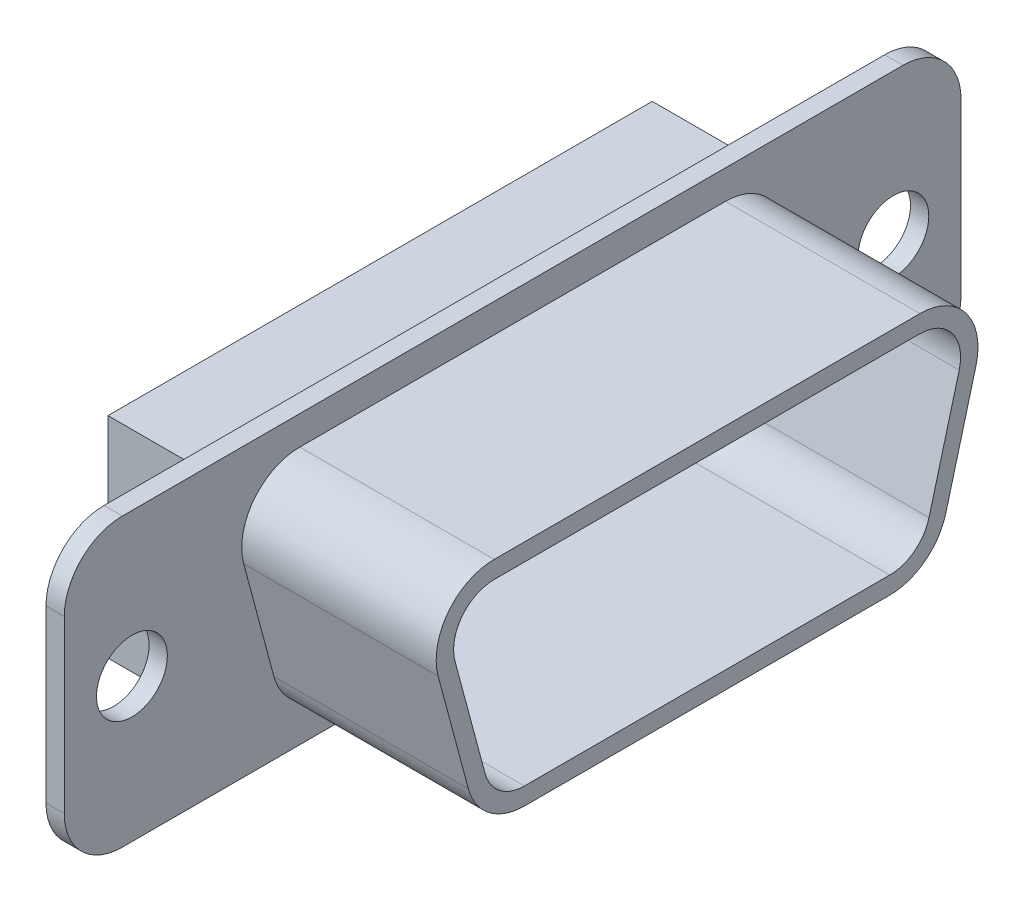
ISO-10303-21;
HEADER;
FILE_DESCRIPTION(('STEP AP214'),'2;1');
FILE_NAME('part.step','',(''),(''),'','','');
FILE_SCHEMA(('AUTOMOTIVE_DESIGN { 1 0 10303 214 1 1 1 1 }'));
ENDSEC;
DATA;
#1=APPLICATION_CONTEXT('core data for automotive mechanical design processes');
#2=APPLICATION_PROTOCOL_DEFINITION('international standard','automotive_design',2000,#1);
#3=PRODUCT_CONTEXT('',#1,'mechanical');
#4=PRODUCT('Part','Part','',(#3));
#5=PRODUCT_RELATED_PRODUCT_CATEGORY('part','',(#4));
#6=PRODUCT_DEFINITION_FORMATION('','',#4);
#7=PRODUCT_DEFINITION_CONTEXT('part definition',#1,'design');
#8=PRODUCT_DEFINITION('design','',#6,#7);
#9=PRODUCT_DEFINITION_SHAPE('','',#8);
#10=(LENGTH_UNIT() NAMED_UNIT(*) SI_UNIT(.MILLI.,.METRE.));
#11=(NAMED_UNIT(*) PLANE_ANGLE_UNIT() SI_UNIT($,.RADIAN.));
#12=(NAMED_UNIT(*) SI_UNIT($,.STERADIAN.) SOLID_ANGLE_UNIT());
#13=UNCERTAINTY_MEASURE_WITH_UNIT(LENGTH_MEASURE(1.E-05),#10,'distance_accuracy_value','');
#14=(GEOMETRIC_REPRESENTATION_CONTEXT(3) GLOBAL_UNCERTAINTY_ASSIGNED_CONTEXT((#13)) GLOBAL_UNIT_ASSIGNED_CONTEXT((#10,
#11,#12)) REPRESENTATION_CONTEXT('',''));
#15=CARTESIAN_POINT('',(0.,0.,0.));
#16=DIRECTION('',(0.,0.,1.));
#17=DIRECTION('',(1.,0.,0.));
#18=AXIS2_PLACEMENT_3D('',#15,#16,#17);
#19=CARTESIAN_POINT('',(0.,3.735,-17.08));
#20=DIRECTION('',(1.,0.,0.));
#21=DIRECTION('',(0.,0.,-1.));
#22=AXIS2_PLACEMENT_3D('',#19,#20,#21);
#23=PLANE('',#22);
#24=CARTESIAN_POINT('',(0.,3.735,-17.08));
#25=DIRECTION('',(1.,0.,0.));
#26=DIRECTION('',(0.,0.,-1.));
#27=AXIS2_PLACEMENT_3D('',#24,#25,#26);
#28=CIRCLE('',#27,2.54);
#29=CARTESIAN_POINT('',(0.,3.73499999999998,-19.62));
#30=VERTEX_POINT('',#29);
#31=CARTESIAN_POINT('',(0.,6.275,-17.08));
#32=VERTEX_POINT('',#31);
#33=EDGE_CURVE('E379',#30,#32,#28,.T.);
#34=ORIENTED_EDGE('',*,*,#33,.F.);
#35=DIRECTION('',(0.,1.,0.));
#36=VECTOR('',#35,1.);
#37=CARTESIAN_POINT('',(0.,-3.73499999999998,-19.62));
#38=LINE('',#37,#36);
#39=CARTESIAN_POINT('',(0.,-3.73499999999998,-19.62));
#40=VERTEX_POINT('',#39);
#41=EDGE_CURVE('E384',#40,#30,#38,.T.);
#42=ORIENTED_EDGE('',*,*,#41,.F.);
#43=CARTESIAN_POINT('',(0.,-3.735,-17.08));
#44=DIRECTION('',(1.,0.,0.));
#45=DIRECTION('',(0.,0.,-1.));
#46=AXIS2_PLACEMENT_3D('',#43,#44,#45);
#47=CIRCLE('',#46,2.54);
#48=CARTESIAN_POINT('',(0.,-6.275,-17.08));
#49=VERTEX_POINT('',#48);
#50=EDGE_CURVE('E411',#49,#40,#47,.T.);
#51=ORIENTED_EDGE('',*,*,#50,.F.);
#52=DIRECTION('',(0.,0.,-1.));
#53=VECTOR('',#52,1.);
#54=CARTESIAN_POINT('',(0.,-6.275,17.08));
#55=LINE('',#54,#53);
#56=CARTESIAN_POINT('',(0.,-6.275,17.08));
#57=VERTEX_POINT('',#56);
#58=EDGE_CURVE('E409',#57,#49,#55,.T.);
#59=ORIENTED_EDGE('',*,*,#58,.F.);
#60=CARTESIAN_POINT('',(0.,-3.735,17.08));
#61=DIRECTION('',(1.,0.,0.));
#62=DIRECTION('',(0.,0.,1.));
#63=AXIS2_PLACEMENT_3D('',#60,#61,#62);
#64=CIRCLE('',#63,2.54);
#65=CARTESIAN_POINT('',(0.,-3.73499999999998,19.62));
#66=VERTEX_POINT('',#65);
#67=EDGE_CURVE('E407',#66,#57,#64,.T.);
#68=ORIENTED_EDGE('',*,*,#67,.F.);
#69=DIRECTION('',(0.,-1.,0.));
#70=VECTOR('',#69,1.);
#71=CARTESIAN_POINT('',(0.,-3.73499999999998,19.62));
#72=LINE('',#71,#70);
#73=CARTESIAN_POINT('',(0.,3.73499999999998,19.62));
#74=VERTEX_POINT('',#73);
#75=EDGE_CURVE('E405',#74,#66,#72,.T.);
#76=ORIENTED_EDGE('',*,*,#75,.F.);
#77=CARTESIAN_POINT('',(0.,3.735,17.08));
#78=DIRECTION('',(1.,0.,0.));
#79=DIRECTION('',(0.,0.,-1.));
#80=AXIS2_PLACEMENT_3D('',#77,#78,#79);
#81=CIRCLE('',#80,2.54);
#82=CARTESIAN_POINT('',(0.,6.275,17.08));
#83=VERTEX_POINT('',#82);
#84=EDGE_CURVE('E403',#83,#74,#81,.T.);
#85=ORIENTED_EDGE('',*,*,#84,.F.);
#86=DIRECTION('',(0.,0.,1.));
#87=VECTOR('',#86,1.);
#88=CARTESIAN_POINT('',(0.,6.275,17.08));
#89=LINE('',#88,#87);
#90=EDGE_CURVE('E401',#32,#83,#89,.T.);
#91=ORIENTED_EDGE('',*,*,#90,.F.);
#92=EDGE_LOOP('',(#34,#42,#51,#59,#68,#76,#85,#91));
#93=FACE_BOUND('',#92,.T.);
#94=CARTESIAN_POINT('',(0.,0.,-16.66));
#95=DIRECTION('',(1.,0.,0.));
#96=DIRECTION('',(0.,0.,-1.));
#97=AXIS2_PLACEMENT_3D('',#94,#95,#96);
#98=CIRCLE('',#97,1.549999948);
#99=CARTESIAN_POINT('',(0.,0.,-18.209999948));
#100=VERTEX_POINT('',#99);
#101=EDGE_CURVE('E255',#100,#100,#98,.T.);
#102=ORIENTED_EDGE('',*,*,#101,.T.);
#103=EDGE_LOOP('',(#102));
#104=FACE_BOUND('',#103,.T.);
#105=CARTESIAN_POINT('',(0.,0.,16.66));
#106=DIRECTION('',(1.,0.,0.));
#107=DIRECTION('',(0.,0.,-1.));
#108=AXIS2_PLACEMENT_3D('',#105,#106,#107);
#109=CIRCLE('',#108,1.549999948);
#110=CARTESIAN_POINT('',(0.,0.,15.110000052));
#111=VERTEX_POINT('',#110);
#112=EDGE_CURVE('E244',#111,#111,#109,.T.);
#113=ORIENTED_EDGE('',*,*,#112,.T.);
#114=EDGE_LOOP('',(#113));
#115=FACE_BOUND('',#114,.T.);
#116=DIRECTION('',(0.,1.,0.));
#117=VECTOR('',#116,1.);
#118=CARTESIAN_POINT('',(0.,-4.5957741823946,11.9090496204659));
#119=LINE('',#118,#117);
#120=CARTESIAN_POINT('',(0.,-4.5957741823946,11.9090496204659));
#121=VERTEX_POINT('',#120);
#122=CARTESIAN_POINT('',(0.,4.5957741823946,11.9090496204659));
#123=VERTEX_POINT('',#122);
#124=EDGE_CURVE('E240',#121,#123,#119,.T.);
#125=ORIENTED_EDGE('',*,*,#124,.F.);
#126=DIRECTION('',(0.,0.,1.));
#127=VECTOR('',#126,1.);
#128=CARTESIAN_POINT('',(0.,-4.5957741823946,-11.9090496204659));
#129=LINE('',#128,#127);
#130=CARTESIAN_POINT('',(0.,-4.5957741823946,-11.9090496204659));
#131=VERTEX_POINT('',#130);
#132=EDGE_CURVE('E237',#131,#121,#129,.T.);
#133=ORIENTED_EDGE('',*,*,#132,.F.);
#134=DIRECTION('',(0.,-1.,0.));
#135=VECTOR('',#134,1.);
#136=CARTESIAN_POINT('',(0.,-4.5957741823946,-11.9090496204659));
#137=LINE('',#136,#135);
#138=CARTESIAN_POINT('',(0.,4.5957741823946,-11.9090496204659));
#139=VERTEX_POINT('',#138);
#140=EDGE_CURVE('E55',#139,#131,#137,.T.);
#141=ORIENTED_EDGE('',*,*,#140,.F.);
#142=DIRECTION('',(0.,0.,-1.));
#143=VECTOR('',#142,1.);
#144=CARTESIAN_POINT('',(0.,4.5957741823946,-11.9090496204659));
#145=LINE('',#144,#143);
#146=EDGE_CURVE('E50',#123,#139,#145,.T.);
#147=ORIENTED_EDGE('',*,*,#146,.F.);
#148=EDGE_LOOP('',(#125,#133,#141,#147));
#149=FACE_BOUND('',#148,.T.);
#150=ADVANCED_FACE('F35',(#93,#104,#115,#149),#23,.F.);
#151=CARTESIAN_POINT('',(0.8,3.735,-17.08));
#152=DIRECTION('',(1.,0.,0.));
#153=DIRECTION('',(0.,0.,-1.));
#154=AXIS2_PLACEMENT_3D('',#151,#152,#153);
#155=PLANE('',#154);
#156=CARTESIAN_POINT('',(0.8,0.,16.66));
#157=DIRECTION('',(1.,0.,0.));
#158=DIRECTION('',(0.,0.,-1.));
#159=AXIS2_PLACEMENT_3D('',#156,#157,#158);
#160=CIRCLE('',#159,1.549999948);
#161=CARTESIAN_POINT('',(0.8,0.,15.110000052));
#162=VERTEX_POINT('',#161);
#163=EDGE_CURVE('E241',#162,#162,#160,.T.);
#164=ORIENTED_EDGE('',*,*,#163,.F.);
#165=EDGE_LOOP('',(#164));
#166=FACE_BOUND('',#165,.T.);
#167=CARTESIAN_POINT('',(0.8,0.,-16.66));
#168=DIRECTION('',(1.,0.,0.));
#169=DIRECTION('',(0.,0.,-1.));
#170=AXIS2_PLACEMENT_3D('',#167,#168,#169);
#171=CIRCLE('',#170,1.549999948);
#172=CARTESIAN_POINT('',(0.8,0.,-18.209999948));
#173=VERTEX_POINT('',#172);
#174=EDGE_CURVE('E252',#173,#173,#171,.T.);
#175=ORIENTED_EDGE('',*,*,#174,.F.);
#176=EDGE_LOOP('',(#175));
#177=FACE_BOUND('',#176,.T.);
#178=CARTESIAN_POINT('',(0.8,3.735,-17.08));
#179=DIRECTION('',(1.,0.,0.));
#180=DIRECTION('',(0.,0.,-1.));
#181=AXIS2_PLACEMENT_3D('',#178,#179,#180);
#182=CIRCLE('',#181,2.54);
#183=CARTESIAN_POINT('',(0.8,3.73499999999998,-19.62));
#184=VERTEX_POINT('',#183);
#185=CARTESIAN_POINT('',(0.8,6.275,-17.08));
#186=VERTEX_POINT('',#185);
#187=EDGE_CURVE('E380',#184,#186,#182,.T.);
#188=ORIENTED_EDGE('',*,*,#187,.T.);
#189=DIRECTION('',(0.,0.,1.));
#190=VECTOR('',#189,1.);
#191=CARTESIAN_POINT('',(0.8,6.275,17.08));
#192=LINE('',#191,#190);
#193=CARTESIAN_POINT('',(0.8,6.275,17.08));
#194=VERTEX_POINT('',#193);
#195=EDGE_CURVE('E383',#186,#194,#192,.T.);
#196=ORIENTED_EDGE('',*,*,#195,.T.);
#197=CARTESIAN_POINT('',(0.8,3.735,17.08));
#198=DIRECTION('',(1.,0.,0.));
#199=DIRECTION('',(0.,0.,-1.));
#200=AXIS2_PLACEMENT_3D('',#197,#198,#199);
#201=CIRCLE('',#200,2.54);
#202=CARTESIAN_POINT('',(0.8,3.73499999999998,19.62));
#203=VERTEX_POINT('',#202);
#204=EDGE_CURVE('E386',#194,#203,#201,.T.);
#205=ORIENTED_EDGE('',*,*,#204,.T.);
#206=DIRECTION('',(0.,-1.,0.));
#207=VECTOR('',#206,1.);
#208=CARTESIAN_POINT('',(0.8,-3.73499999999998,19.62));
#209=LINE('',#208,#207);
#210=CARTESIAN_POINT('',(0.8,-3.73499999999998,19.62));
#211=VERTEX_POINT('',#210);
#212=EDGE_CURVE('E388',#203,#211,#209,.T.);
#213=ORIENTED_EDGE('',*,*,#212,.T.);
#214=CARTESIAN_POINT('',(0.8,-3.735,17.08));
#215=DIRECTION('',(1.,0.,0.));
#216=DIRECTION('',(0.,0.,1.));
#217=AXIS2_PLACEMENT_3D('',#214,#215,#216);
#218=CIRCLE('',#217,2.54);
#219=CARTESIAN_POINT('',(0.8,-6.275,17.08));
#220=VERTEX_POINT('',#219);
#221=EDGE_CURVE('E390',#211,#220,#218,.T.);
#222=ORIENTED_EDGE('',*,*,#221,.T.);
#223=DIRECTION('',(0.,0.,-1.));
#224=VECTOR('',#223,1.);
#225=CARTESIAN_POINT('',(0.8,-6.275,17.08));
#226=LINE('',#225,#224);
#227=CARTESIAN_POINT('',(0.8,-6.275,-17.08));
#228=VERTEX_POINT('',#227);
#229=EDGE_CURVE('E392',#220,#228,#226,.T.);
#230=ORIENTED_EDGE('',*,*,#229,.T.);
#231=CARTESIAN_POINT('',(0.8,-3.735,-17.08));
#232=DIRECTION('',(1.,0.,0.));
#233=DIRECTION('',(0.,0.,-1.));
#234=AXIS2_PLACEMENT_3D('',#231,#232,#233);
#235=CIRCLE('',#234,2.54);
#236=CARTESIAN_POINT('',(0.8,-3.73499999999998,-19.62));
#237=VERTEX_POINT('',#236);
#238=EDGE_CURVE('E394',#228,#237,#235,.T.);
#239=ORIENTED_EDGE('',*,*,#238,.T.);
#240=DIRECTION('',(0.,1.,0.));
#241=VECTOR('',#240,1.);
#242=CARTESIAN_POINT('',(0.8,-3.73499999999998,-19.62));
#243=LINE('',#242,#241);
#244=EDGE_CURVE('E396',#237,#184,#243,.T.);
#245=ORIENTED_EDGE('',*,*,#244,.T.);
#246=EDGE_LOOP('',(#188,#196,#205,#213,#222,#230,#239,#245));
#247=FACE_BOUND('',#246,.T.);
#248=DIRECTION('',(0.,-0.96592582628907,-0.258819045102514));
#249=VECTOR('',#248,1.);
#250=CARTESIAN_POINT('',(0.8,-3.12240037456038,10.4472696330722));
#251=LINE('',#250,#249);
#252=CARTESIAN_POINT('',(0.8,1.80759962543962,11.7682591517576));
#253=VERTEX_POINT('',#252);
#254=CARTESIAN_POINT('',(0.8,-3.12240037456038,10.4472696330722));
#255=VERTEX_POINT('',#254);
#256=EDGE_CURVE('E344',#253,#255,#251,.T.);
#257=ORIENTED_EDGE('',*,*,#256,.F.);
#258=CARTESIAN_POINT('',(0.8,2.465,9.31480755298336));
#259=DIRECTION('',(1.,0.,0.));
#260=DIRECTION('',(0.,0.,1.));
#261=AXIS2_PLACEMENT_3D('',#258,#259,#260);
#262=CIRCLE('',#261,2.54);
#263=CARTESIAN_POINT('',(0.8,5.005,9.31480755298336));
#264=VERTEX_POINT('',#263);
#265=EDGE_CURVE('E308',#264,#253,#262,.T.);
#266=ORIENTED_EDGE('',*,*,#265,.F.);
#267=DIRECTION('',(0.,0.,1.));
#268=VECTOR('',#267,1.);
#269=CARTESIAN_POINT('',(0.8,5.005,9.31480755298336));
#270=LINE('',#269,#268);
#271=CARTESIAN_POINT('',(0.8,5.005,-9.31480755298336));
#272=VERTEX_POINT('',#271);
#273=EDGE_CURVE('E327',#272,#264,#270,.T.);
#274=ORIENTED_EDGE('',*,*,#273,.F.);
#275=CARTESIAN_POINT('',(0.8,2.465,-9.31480755298336));
#276=DIRECTION('',(1.,0.,0.));
#277=DIRECTION('',(0.,0.,1.));
#278=AXIS2_PLACEMENT_3D('',#275,#276,#277);
#279=CIRCLE('',#278,2.54);
#280=CARTESIAN_POINT('',(0.8,1.80759962543962,-11.7682591517576));
#281=VERTEX_POINT('',#280);
#282=EDGE_CURVE('E354',#281,#272,#279,.T.);
#283=ORIENTED_EDGE('',*,*,#282,.F.);
#284=DIRECTION('',(0.,0.96592582628907,-0.258819045102514));
#285=VECTOR('',#284,1.);
#286=CARTESIAN_POINT('',(0.8,-3.12240037456038,-10.4472696330722));
#287=LINE('',#286,#285);
#288=CARTESIAN_POINT('',(0.8,-3.12240037456038,-10.4472696330722));
#289=VERTEX_POINT('',#288);
#290=EDGE_CURVE('E352',#289,#281,#287,.T.);
#291=ORIENTED_EDGE('',*,*,#290,.F.);
#292=CARTESIAN_POINT('',(0.8,-2.465,-7.99381803429796));
#293=DIRECTION('',(1.,0.,0.));
#294=DIRECTION('',(0.,0.,1.));
#295=AXIS2_PLACEMENT_3D('',#292,#293,#294);
#296=CIRCLE('',#295,2.54);
#297=CARTESIAN_POINT('',(0.8,-5.005,-7.99381803429796));
#298=VERTEX_POINT('',#297);
#299=EDGE_CURVE('E350',#298,#289,#296,.T.);
#300=ORIENTED_EDGE('',*,*,#299,.F.);
#301=DIRECTION('',(0.,0.,-1.));
#302=VECTOR('',#301,1.);
#303=CARTESIAN_POINT('',(0.8,-5.005,7.99381803429796));
#304=LINE('',#303,#302);
#305=CARTESIAN_POINT('',(0.8,-5.005,7.99381803429796));
#306=VERTEX_POINT('',#305);
#307=EDGE_CURVE('E348',#306,#298,#304,.T.);
#308=ORIENTED_EDGE('',*,*,#307,.F.);
#309=CARTESIAN_POINT('',(0.8,-2.465,7.99381803429796));
#310=DIRECTION('',(1.,0.,0.));
#311=DIRECTION('',(0.,0.,-1.));
#312=AXIS2_PLACEMENT_3D('',#309,#310,#311);
#313=CIRCLE('',#312,2.54);
#314=EDGE_CURVE('E346',#255,#306,#313,.T.);
#315=ORIENTED_EDGE('',*,*,#314,.F.);
#316=EDGE_LOOP('',(#257,#266,#274,#283,#291,#300,#308,#315));
#317=FACE_BOUND('',#316,.T.);
#318=ADVANCED_FACE('F454',(#166,#177,#247,#317),#155,.T.);
#319=CARTESIAN_POINT('',(0.8,3.735,-17.08));
#320=DIRECTION('',(-1.,0.,0.));
#321=DIRECTION('',(0.,0.,1.));
#322=AXIS2_PLACEMENT_3D('',#319,#320,#321);
#323=CYLINDRICAL_SURFACE('',#322,2.54);
#324=ORIENTED_EDGE('',*,*,#33,.T.);
#325=DIRECTION('',(-1.,0.,0.));
#326=VECTOR('',#325,1.);
#327=CARTESIAN_POINT('',(0.8,6.275,-17.08));
#328=LINE('',#327,#326);
#329=EDGE_CURVE('E11',#186,#32,#328,.T.);
#330=ORIENTED_EDGE('',*,*,#329,.F.);
#331=ORIENTED_EDGE('',*,*,#187,.F.);
#332=DIRECTION('',(-1.,0.,0.));
#333=VECTOR('',#332,1.);
#334=CARTESIAN_POINT('',(0.8,3.73499999999998,-19.62));
#335=LINE('',#334,#333);
#336=EDGE_CURVE('E398',#184,#30,#335,.T.);
#337=ORIENTED_EDGE('',*,*,#336,.T.);
#338=EDGE_LOOP('',(#324,#330,#331,#337));
#339=FACE_BOUND('',#338,.T.);
#340=ADVANCED_FACE('F37',(#339),#323,.T.);
#341=CARTESIAN_POINT('',(0.8,6.275,17.08));
#342=DIRECTION('',(0.,-1.,0.));
#343=DIRECTION('',(0.,0.,-1.));
#344=AXIS2_PLACEMENT_3D('',#341,#342,#343);
#345=PLANE('',#344);
#346=ORIENTED_EDGE('',*,*,#90,.T.);
#347=DIRECTION('',(-1.,0.,0.));
#348=VECTOR('',#347,1.);
#349=CARTESIAN_POINT('',(0.8,6.275,17.08));
#350=LINE('',#349,#348);
#351=EDGE_CURVE('E43',#194,#83,#350,.T.);
#352=ORIENTED_EDGE('',*,*,#351,.F.);
#353=ORIENTED_EDGE('',*,*,#195,.F.);
#354=ORIENTED_EDGE('',*,*,#329,.T.);
#355=EDGE_LOOP('',(#346,#352,#353,#354));
#356=FACE_BOUND('',#355,.T.);
#357=ADVANCED_FACE('F459',(#356),#345,.F.);
#358=CARTESIAN_POINT('',(0.8,3.735,17.08));
#359=DIRECTION('',(-1.,0.,0.));
#360=DIRECTION('',(0.,0.,1.));
#361=AXIS2_PLACEMENT_3D('',#358,#359,#360);
#362=CYLINDRICAL_SURFACE('',#361,2.54);
#363=ORIENTED_EDGE('',*,*,#84,.T.);
#364=DIRECTION('',(-1.,0.,0.));
#365=VECTOR('',#364,1.);
#366=CARTESIAN_POINT('',(0.8,3.73499999999998,19.62));
#367=LINE('',#366,#365);
#368=EDGE_CURVE('E428',#203,#74,#367,.T.);
#369=ORIENTED_EDGE('',*,*,#368,.F.);
#370=ORIENTED_EDGE('',*,*,#204,.F.);
#371=ORIENTED_EDGE('',*,*,#351,.T.);
#372=EDGE_LOOP('',(#363,#369,#370,#371));
#373=FACE_BOUND('',#372,.T.);
#374=ADVANCED_FACE('F435',(#373),#362,.T.);
#375=CARTESIAN_POINT('',(0.8,-3.73499999999998,19.62));
#376=DIRECTION('',(0.,0.,-1.));
#377=DIRECTION('',(-1.,0.,0.));
#378=AXIS2_PLACEMENT_3D('',#375,#376,#377);
#379=PLANE('',#378);
#380=ORIENTED_EDGE('',*,*,#75,.T.);
#381=DIRECTION('',(-1.,0.,0.));
#382=VECTOR('',#381,1.);
#383=CARTESIAN_POINT('',(0.8,-3.73499999999998,19.62));
#384=LINE('',#383,#382);
#385=EDGE_CURVE('E425',#211,#66,#384,.T.);
#386=ORIENTED_EDGE('',*,*,#385,.F.);
#387=ORIENTED_EDGE('',*,*,#212,.F.);
#388=ORIENTED_EDGE('',*,*,#368,.T.);
#389=EDGE_LOOP('',(#380,#386,#387,#388));
#390=FACE_BOUND('',#389,.T.);
#391=ADVANCED_FACE('F446',(#390),#379,.F.);
#392=CARTESIAN_POINT('',(0.8,-3.735,17.08));
#393=DIRECTION('',(-1.,0.,0.));
#394=DIRECTION('',(0.,0.,1.));
#395=AXIS2_PLACEMENT_3D('',#392,#393,#394);
#396=CYLINDRICAL_SURFACE('',#395,2.54);
#397=ORIENTED_EDGE('',*,*,#67,.T.);
#398=DIRECTION('',(-1.,0.,0.));
#399=VECTOR('',#398,1.);
#400=CARTESIAN_POINT('',(0.8,-6.275,17.08));
#401=LINE('',#400,#399);
#402=EDGE_CURVE('E422',#220,#57,#401,.T.);
#403=ORIENTED_EDGE('',*,*,#402,.F.);
#404=ORIENTED_EDGE('',*,*,#221,.F.);
#405=ORIENTED_EDGE('',*,*,#385,.T.);
#406=EDGE_LOOP('',(#397,#403,#404,#405));
#407=FACE_BOUND('',#406,.T.);
#408=ADVANCED_FACE('F450',(#407),#396,.T.);
#409=CARTESIAN_POINT('',(0.8,-6.275,17.08));
#410=DIRECTION('',(0.,1.,0.));
#411=DIRECTION('',(0.,0.,1.));
#412=AXIS2_PLACEMENT_3D('',#409,#410,#411);
#413=PLANE('',#412);
#414=ORIENTED_EDGE('',*,*,#58,.T.);
#415=DIRECTION('',(-1.,0.,0.));
#416=VECTOR('',#415,1.);
#417=CARTESIAN_POINT('',(0.8,-6.275,-17.08));
#418=LINE('',#417,#416);
#419=EDGE_CURVE('E419',#228,#49,#418,.T.);
#420=ORIENTED_EDGE('',*,*,#419,.F.);
#421=ORIENTED_EDGE('',*,*,#229,.F.);
#422=ORIENTED_EDGE('',*,*,#402,.T.);
#423=EDGE_LOOP('',(#414,#420,#421,#422));
#424=FACE_BOUND('',#423,.T.);
#425=ADVANCED_FACE('F472',(#424),#413,.F.);
#426=CARTESIAN_POINT('',(0.8,-3.735,-17.08));
#427=DIRECTION('',(-1.,0.,0.));
#428=DIRECTION('',(0.,0.,1.));
#429=AXIS2_PLACEMENT_3D('',#426,#427,#428);
#430=CYLINDRICAL_SURFACE('',#429,2.54);
#431=ORIENTED_EDGE('',*,*,#50,.T.);
#432=DIRECTION('',(-1.,0.,0.));
#433=VECTOR('',#432,1.);
#434=CARTESIAN_POINT('',(0.8,-3.73499999999998,-19.62));
#435=LINE('',#434,#433);
#436=EDGE_CURVE('E416',#237,#40,#435,.T.);
#437=ORIENTED_EDGE('',*,*,#436,.F.);
#438=ORIENTED_EDGE('',*,*,#238,.F.);
#439=ORIENTED_EDGE('',*,*,#419,.T.);
#440=EDGE_LOOP('',(#431,#437,#438,#439));
#441=FACE_BOUND('',#440,.T.);
#442=ADVANCED_FACE('F470',(#441),#430,.T.);
#443=CARTESIAN_POINT('',(0.8,-3.73499999999998,-19.62));
#444=DIRECTION('',(0.,0.,1.));
#445=DIRECTION('',(1.,0.,0.));
#446=AXIS2_PLACEMENT_3D('',#443,#444,#445);
#447=PLANE('',#446);
#448=ORIENTED_EDGE('',*,*,#41,.T.);
#449=ORIENTED_EDGE('',*,*,#336,.F.);
#450=ORIENTED_EDGE('',*,*,#244,.F.);
#451=ORIENTED_EDGE('',*,*,#436,.T.);
#452=EDGE_LOOP('',(#448,#449,#450,#451));
#453=FACE_BOUND('',#452,.T.);
#454=ADVANCED_FACE('F465',(#453),#447,.F.);
#455=CARTESIAN_POINT('',(9.309,2.465,9.31480755298336));
#456=DIRECTION('',(-1.,0.,0.));
#457=DIRECTION('',(0.,0.,1.));
#458=AXIS2_PLACEMENT_3D('',#455,#456,#457);
#459=CYLINDRICAL_SURFACE('',#458,2.54);
#460=ORIENTED_EDGE('',*,*,#265,.T.);
#461=DIRECTION('',(-1.,0.,0.));
#462=VECTOR('',#461,1.);
#463=CARTESIAN_POINT('',(9.309,1.80759962543962,11.7682591517576));
#464=LINE('',#463,#462);
#465=CARTESIAN_POINT('',(9.309,1.80759962543962,11.7682591517576));
#466=VERTEX_POINT('',#465);
#467=EDGE_CURVE('E377',#466,#253,#464,.T.);
#468=ORIENTED_EDGE('',*,*,#467,.F.);
#469=CARTESIAN_POINT('',(9.309,2.465,9.31480755298336));
#470=DIRECTION('',(1.,0.,0.));
#471=DIRECTION('',(0.,0.,1.));
#472=AXIS2_PLACEMENT_3D('',#469,#470,#471);
#473=CIRCLE('',#472,2.54);
#474=CARTESIAN_POINT('',(9.309,5.005,9.31480755298336));
#475=VERTEX_POINT('',#474);
#476=EDGE_CURVE('E323',#475,#466,#473,.T.);
#477=ORIENTED_EDGE('',*,*,#476,.F.);
#478=DIRECTION('',(-1.,0.,0.));
#479=VECTOR('',#478,1.);
#480=CARTESIAN_POINT('',(9.309,5.005,9.31480755298336));
#481=LINE('',#480,#479);
#482=EDGE_CURVE('E341',#475,#264,#481,.T.);
#483=ORIENTED_EDGE('',*,*,#482,.T.);
#484=EDGE_LOOP('',(#460,#468,#477,#483));
#485=FACE_BOUND('',#484,.T.);
#486=ADVANCED_FACE('F491',(#485),#459,.T.);
#487=CARTESIAN_POINT('',(9.309,-3.12240037456038,10.4472696330722));
#488=DIRECTION('',(0.,0.258819045102514,-0.96592582628907));
#489=DIRECTION('',(0.,0.96592582628907,0.258819045102514));
#490=AXIS2_PLACEMENT_3D('',#487,#488,#489);
#491=PLANE('',#490);
#492=ORIENTED_EDGE('',*,*,#256,.T.);
#493=DIRECTION('',(-1.,0.,0.));
#494=VECTOR('',#493,1.);
#495=CARTESIAN_POINT('',(9.309,-3.12240037456038,10.4472696330722));
#496=LINE('',#495,#494);
#497=CARTESIAN_POINT('',(9.309,-3.12240037456038,10.4472696330722));
#498=VERTEX_POINT('',#497);
#499=EDGE_CURVE('E374',#498,#255,#496,.T.);
#500=ORIENTED_EDGE('',*,*,#499,.F.);
#501=DIRECTION('',(0.,-0.96592582628907,-0.258819045102514));
#502=VECTOR('',#501,1.);
#503=CARTESIAN_POINT('',(9.309,-3.12240037456038,10.4472696330722));
#504=LINE('',#503,#502);
#505=EDGE_CURVE('E326',#466,#498,#504,.T.);
#506=ORIENTED_EDGE('',*,*,#505,.F.);
#507=ORIENTED_EDGE('',*,*,#467,.T.);
#508=EDGE_LOOP('',(#492,#500,#506,#507));
#509=FACE_BOUND('',#508,.T.);
#510=ADVANCED_FACE('F495',(#509),#491,.F.);
#511=CARTESIAN_POINT('',(9.309,-2.465,7.99381803429796));
#512=DIRECTION('',(-1.,0.,0.));
#513=DIRECTION('',(0.,0.,1.));
#514=AXIS2_PLACEMENT_3D('',#511,#512,#513);
#515=CYLINDRICAL_SURFACE('',#514,2.54);
#516=ORIENTED_EDGE('',*,*,#314,.T.);
#517=DIRECTION('',(-1.,0.,0.));
#518=VECTOR('',#517,1.);
#519=CARTESIAN_POINT('',(9.309,-5.005,7.99381803429796));
#520=LINE('',#519,#518);
#521=CARTESIAN_POINT('',(9.309,-5.005,7.99381803429796));
#522=VERTEX_POINT('',#521);
#523=EDGE_CURVE('E371',#522,#306,#520,.T.);
#524=ORIENTED_EDGE('',*,*,#523,.F.);
#525=CARTESIAN_POINT('',(9.309,-2.465,7.99381803429796));
#526=DIRECTION('',(1.,0.,0.));
#527=DIRECTION('',(0.,0.,-1.));
#528=AXIS2_PLACEMENT_3D('',#525,#526,#527);
#529=CIRCLE('',#528,2.54);
#530=EDGE_CURVE('E329',#498,#522,#529,.T.);
#531=ORIENTED_EDGE('',*,*,#530,.F.);
#532=ORIENTED_EDGE('',*,*,#499,.T.);
#533=EDGE_LOOP('',(#516,#524,#531,#532));
#534=FACE_BOUND('',#533,.T.);
#535=ADVANCED_FACE('F500',(#534),#515,.T.);
#536=CARTESIAN_POINT('',(9.309,-5.005,7.99381803429796));
#537=DIRECTION('',(0.,1.,0.));
#538=DIRECTION('',(0.,0.,1.));
#539=AXIS2_PLACEMENT_3D('',#536,#537,#538);
#540=PLANE('',#539);
#541=ORIENTED_EDGE('',*,*,#307,.T.);
#542=DIRECTION('',(-1.,0.,0.));
#543=VECTOR('',#542,1.);
#544=CARTESIAN_POINT('',(9.309,-5.005,-7.99381803429796));
#545=LINE('',#544,#543);
#546=CARTESIAN_POINT('',(9.309,-5.005,-7.99381803429796));
#547=VERTEX_POINT('',#546);
#548=EDGE_CURVE('E368',#547,#298,#545,.T.);
#549=ORIENTED_EDGE('',*,*,#548,.F.);
#550=DIRECTION('',(0.,0.,-1.));
#551=VECTOR('',#550,1.);
#552=CARTESIAN_POINT('',(9.309,-5.005,7.99381803429796));
#553=LINE('',#552,#551);
#554=EDGE_CURVE('E331',#522,#547,#553,.T.);
#555=ORIENTED_EDGE('',*,*,#554,.F.);
#556=ORIENTED_EDGE('',*,*,#523,.T.);
#557=EDGE_LOOP('',(#541,#549,#555,#556));
#558=FACE_BOUND('',#557,.T.);
#559=ADVANCED_FACE('F506',(#558),#540,.F.);
#560=CARTESIAN_POINT('',(9.309,-2.465,-7.99381803429796));
#561=DIRECTION('',(-1.,0.,0.));
#562=DIRECTION('',(0.,0.,1.));
#563=AXIS2_PLACEMENT_3D('',#560,#561,#562);
#564=CYLINDRICAL_SURFACE('',#563,2.54);
#565=ORIENTED_EDGE('',*,*,#299,.T.);
#566=DIRECTION('',(-1.,0.,0.));
#567=VECTOR('',#566,1.);
#568=CARTESIAN_POINT('',(9.309,-3.12240037456038,-10.4472696330722));
#569=LINE('',#568,#567);
#570=CARTESIAN_POINT('',(9.309,-3.12240037456038,-10.4472696330722));
#571=VERTEX_POINT('',#570);
#572=EDGE_CURVE('E365',#571,#289,#569,.T.);
#573=ORIENTED_EDGE('',*,*,#572,.F.);
#574=CARTESIAN_POINT('',(9.309,-2.465,-7.99381803429796));
#575=DIRECTION('',(1.,0.,0.));
#576=DIRECTION('',(0.,0.,1.));
#577=AXIS2_PLACEMENT_3D('',#574,#575,#576);
#578=CIRCLE('',#577,2.54);
#579=EDGE_CURVE('E333',#547,#571,#578,.T.);
#580=ORIENTED_EDGE('',*,*,#579,.F.);
#581=ORIENTED_EDGE('',*,*,#548,.T.);
#582=EDGE_LOOP('',(#565,#573,#580,#581));
#583=FACE_BOUND('',#582,.T.);
#584=ADVANCED_FACE('F510',(#583),#564,.T.);
#585=CARTESIAN_POINT('',(9.309,-3.12240037456038,-10.4472696330722));
#586=DIRECTION('',(0.,0.258819045102514,0.96592582628907));
#587=DIRECTION('',(0.,-0.96592582628907,0.258819045102514));
#588=AXIS2_PLACEMENT_3D('',#585,#586,#587);
#589=PLANE('',#588);
#590=ORIENTED_EDGE('',*,*,#290,.T.);
#591=DIRECTION('',(-1.,0.,0.));
#592=VECTOR('',#591,1.);
#593=CARTESIAN_POINT('',(9.309,1.80759962543962,-11.7682591517576));
#594=LINE('',#593,#592);
#595=CARTESIAN_POINT('',(9.309,1.80759962543962,-11.7682591517576));
#596=VERTEX_POINT('',#595);
#597=EDGE_CURVE('E362',#596,#281,#594,.T.);
#598=ORIENTED_EDGE('',*,*,#597,.F.);
#599=DIRECTION('',(0.,0.96592582628907,-0.258819045102514));
#600=VECTOR('',#599,1.);
#601=CARTESIAN_POINT('',(9.309,-3.12240037456038,-10.4472696330722));
#602=LINE('',#601,#600);
#603=EDGE_CURVE('E335',#571,#596,#602,.T.);
#604=ORIENTED_EDGE('',*,*,#603,.F.);
#605=ORIENTED_EDGE('',*,*,#572,.T.);
#606=EDGE_LOOP('',(#590,#598,#604,#605));
#607=FACE_BOUND('',#606,.T.);
#608=ADVANCED_FACE('F514',(#607),#589,.F.);
#609=CARTESIAN_POINT('',(9.309,2.465,-9.31480755298336));
#610=DIRECTION('',(-1.,0.,0.));
#611=DIRECTION('',(0.,0.,1.));
#612=AXIS2_PLACEMENT_3D('',#609,#610,#611);
#613=CYLINDRICAL_SURFACE('',#612,2.54);
#614=ORIENTED_EDGE('',*,*,#282,.T.);
#615=DIRECTION('',(-1.,0.,0.));
#616=VECTOR('',#615,1.);
#617=CARTESIAN_POINT('',(9.309,5.005,-9.31480755298336));
#618=LINE('',#617,#616);
#619=CARTESIAN_POINT('',(9.309,5.005,-9.31480755298336));
#620=VERTEX_POINT('',#619);
#621=EDGE_CURVE('E360',#620,#272,#618,.T.);
#622=ORIENTED_EDGE('',*,*,#621,.F.);
#623=CARTESIAN_POINT('',(9.309,2.465,-9.31480755298336));
#624=DIRECTION('',(1.,0.,0.));
#625=DIRECTION('',(0.,0.,1.));
#626=AXIS2_PLACEMENT_3D('',#623,#624,#625);
#627=CIRCLE('',#626,2.54);
#628=EDGE_CURVE('E337',#596,#620,#627,.T.);
#629=ORIENTED_EDGE('',*,*,#628,.F.);
#630=ORIENTED_EDGE('',*,*,#597,.T.);
#631=EDGE_LOOP('',(#614,#622,#629,#630));
#632=FACE_BOUND('',#631,.T.);
#633=ADVANCED_FACE('F518',(#632),#613,.T.);
#634=CARTESIAN_POINT('',(9.309,5.005,9.31480755298336));
#635=DIRECTION('',(0.,-1.,0.));
#636=DIRECTION('',(0.,0.,-1.));
#637=AXIS2_PLACEMENT_3D('',#634,#635,#636);
#638=PLANE('',#637);
#639=ORIENTED_EDGE('',*,*,#273,.T.);
#640=ORIENTED_EDGE('',*,*,#482,.F.);
#641=DIRECTION('',(0.,0.,1.));
#642=VECTOR('',#641,1.);
#643=CARTESIAN_POINT('',(9.309,5.005,9.31480755298336));
#644=LINE('',#643,#642);
#645=EDGE_CURVE('E339',#620,#475,#644,.T.);
#646=ORIENTED_EDGE('',*,*,#645,.F.);
#647=ORIENTED_EDGE('',*,*,#621,.T.);
#648=EDGE_LOOP('',(#639,#640,#646,#647));
#649=FACE_BOUND('',#648,.T.);
#650=ADVANCED_FACE('F522',(#649),#638,.F.);
#651=CARTESIAN_POINT('',(9.309,2.465,9.31480755298336));
#652=DIRECTION('',(-1.,0.,0.));
#653=DIRECTION('',(0.,0.,1.));
#654=AXIS2_PLACEMENT_3D('',#651,#652,#653);
#655=PLANE('',#654);
#656=DIRECTION('',(0.,-0.96592582628907,-0.258819045102514));
#657=VECTOR('',#656,1.);
#658=CARTESIAN_POINT('',(9.309,2.00481973780773,11.0322236721253));
#659=LINE('',#658,#657);
#660=CARTESIAN_POINT('',(9.309,2.00481973780773,11.0322236721253));
#661=VERTEX_POINT('',#660);
#662=CARTESIAN_POINT('',(9.309,-2.92518026219227,9.71123415343993));
#663=VERTEX_POINT('',#662);
#664=EDGE_CURVE('E286',#661,#663,#659,.T.);
#665=ORIENTED_EDGE('',*,*,#664,.F.);
#666=CARTESIAN_POINT('',(9.309,2.465,9.31480755298336));
#667=DIRECTION('',(1.,0.,0.));
#668=DIRECTION('',(0.,0.,-1.));
#669=AXIS2_PLACEMENT_3D('',#666,#667,#668);
#670=CIRCLE('',#669,1.778);
#671=CARTESIAN_POINT('',(9.309,4.243,9.31480755298336));
#672=VERTEX_POINT('',#671);
#673=EDGE_CURVE('E258',#672,#661,#670,.T.);
#674=ORIENTED_EDGE('',*,*,#673,.F.);
#675=DIRECTION('',(0.,0.,1.));
#676=VECTOR('',#675,1.);
#677=CARTESIAN_POINT('',(9.309,4.243,-9.31480755298336));
#678=LINE('',#677,#676);
#679=CARTESIAN_POINT('',(9.309,4.243,-9.31480755298336));
#680=VERTEX_POINT('',#679);
#681=EDGE_CURVE('E263',#680,#672,#678,.T.);
#682=ORIENTED_EDGE('',*,*,#681,.F.);
#683=CARTESIAN_POINT('',(9.309,2.465,-9.31480755298336));
#684=DIRECTION('',(1.,0.,0.));
#685=DIRECTION('',(0.,0.,-1.));
#686=AXIS2_PLACEMENT_3D('',#683,#684,#685);
#687=CIRCLE('',#686,1.778);
#688=CARTESIAN_POINT('',(9.309,2.00481973780773,-11.0322236721253));
#689=VERTEX_POINT('',#688);
#690=EDGE_CURVE('E301',#689,#680,#687,.T.);
#691=ORIENTED_EDGE('',*,*,#690,.F.);
#692=DIRECTION('',(0.,0.96592582628907,-0.258819045102514));
#693=VECTOR('',#692,1.);
#694=CARTESIAN_POINT('',(9.309,-2.92518026219227,-9.71123415343993));
#695=LINE('',#694,#693);
#696=CARTESIAN_POINT('',(9.309,-2.92518026219227,-9.71123415343993));
#697=VERTEX_POINT('',#696);
#698=EDGE_CURVE('E298',#697,#689,#695,.T.);
#699=ORIENTED_EDGE('',*,*,#698,.F.);
#700=CARTESIAN_POINT('',(9.309,-2.465,-7.99381803429796));
#701=DIRECTION('',(1.,0.,0.));
#702=DIRECTION('',(0.,0.,-1.));
#703=AXIS2_PLACEMENT_3D('',#700,#701,#702);
#704=CIRCLE('',#703,1.778);
#705=CARTESIAN_POINT('',(9.309,-4.243,-7.99381803429796));
#706=VERTEX_POINT('',#705);
#707=EDGE_CURVE('E295',#706,#697,#704,.T.);
#708=ORIENTED_EDGE('',*,*,#707,.F.);
#709=DIRECTION('',(0.,0.,-1.));
#710=VECTOR('',#709,1.);
#711=CARTESIAN_POINT('',(9.309,-4.243,7.99381803429796));
#712=LINE('',#711,#710);
#713=CARTESIAN_POINT('',(9.309,-4.243,7.99381803429796));
#714=VERTEX_POINT('',#713);
#715=EDGE_CURVE('E292',#714,#706,#712,.T.);
#716=ORIENTED_EDGE('',*,*,#715,.F.);
#717=CARTESIAN_POINT('',(9.309,-2.465,7.99381803429796));
#718=DIRECTION('',(1.,0.,0.));
#719=DIRECTION('',(0.,0.,-1.));
#720=AXIS2_PLACEMENT_3D('',#717,#718,#719);
#721=CIRCLE('',#720,1.778);
#722=EDGE_CURVE('E289',#663,#714,#721,.T.);
#723=ORIENTED_EDGE('',*,*,#722,.F.);
#724=EDGE_LOOP('',(#665,#674,#682,#691,#699,#708,#716,#723));
#725=FACE_BOUND('',#724,.T.);
#726=ORIENTED_EDGE('',*,*,#476,.T.);
#727=ORIENTED_EDGE('',*,*,#505,.T.);
#728=ORIENTED_EDGE('',*,*,#530,.T.);
#729=ORIENTED_EDGE('',*,*,#554,.T.);
#730=ORIENTED_EDGE('',*,*,#579,.T.);
#731=ORIENTED_EDGE('',*,*,#603,.T.);
#732=ORIENTED_EDGE('',*,*,#628,.T.);
#733=ORIENTED_EDGE('',*,*,#645,.T.);
#734=EDGE_LOOP('',(#726,#727,#728,#729,#730,#731,#732,#733));
#735=FACE_BOUND('',#734,.T.);
#736=ADVANCED_FACE('F526',(#725,#735),#655,.F.);
#737=CARTESIAN_POINT('',(0.8,2.465,9.31480755298336));
#738=DIRECTION('',(1.,0.,0.));
#739=DIRECTION('',(0.,0.,-1.));
#740=AXIS2_PLACEMENT_3D('',#737,#738,#739);
#741=CYLINDRICAL_SURFACE('',#740,1.778);
#742=ORIENTED_EDGE('',*,*,#673,.T.);
#743=DIRECTION('',(1.,0.,0.));
#744=VECTOR('',#743,1.);
#745=CARTESIAN_POINT('',(0.8,2.00481973780773,11.0322236721253));
#746=LINE('',#745,#744);
#747=CARTESIAN_POINT('',(0.8,2.00481973780773,11.0322236721253));
#748=VERTEX_POINT('',#747);
#749=EDGE_CURVE('E284',#748,#661,#746,.T.);
#750=ORIENTED_EDGE('',*,*,#749,.F.);
#751=CARTESIAN_POINT('',(0.8,2.465,9.31480755298336));
#752=DIRECTION('',(1.,0.,0.));
#753=DIRECTION('',(0.,0.,-1.));
#754=AXIS2_PLACEMENT_3D('',#751,#752,#753);
#755=CIRCLE('',#754,1.778);
#756=CARTESIAN_POINT('',(0.8,4.243,9.31480755298336));
#757=VERTEX_POINT('',#756);
#758=EDGE_CURVE('E259',#757,#748,#755,.T.);
#759=ORIENTED_EDGE('',*,*,#758,.F.);
#760=DIRECTION('',(1.,0.,0.));
#761=VECTOR('',#760,1.);
#762=CARTESIAN_POINT('',(0.8,4.243,9.31480755298336));
#763=LINE('',#762,#761);
#764=EDGE_CURVE('E306',#757,#672,#763,.T.);
#765=ORIENTED_EDGE('',*,*,#764,.T.);
#766=EDGE_LOOP('',(#742,#750,#759,#765));
#767=FACE_BOUND('',#766,.T.);
#768=ADVANCED_FACE('F530',(#767),#741,.F.);
#769=CARTESIAN_POINT('',(0.8,4.243,-9.31480755298336));
#770=DIRECTION('',(0.,1.,0.));
#771=DIRECTION('',(0.,0.,1.));
#772=AXIS2_PLACEMENT_3D('',#769,#770,#771);
#773=PLANE('',#772);
#774=ORIENTED_EDGE('',*,*,#681,.T.);
#775=ORIENTED_EDGE('',*,*,#764,.F.);
#776=DIRECTION('',(0.,0.,1.));
#777=VECTOR('',#776,1.);
#778=CARTESIAN_POINT('',(0.8,4.243,-9.31480755298336));
#779=LINE('',#778,#777);
#780=CARTESIAN_POINT('',(0.8,4.243,-9.31480755298336));
#781=VERTEX_POINT('',#780);
#782=EDGE_CURVE('E281',#781,#757,#779,.T.);
#783=ORIENTED_EDGE('',*,*,#782,.F.);
#784=DIRECTION('',(1.,0.,0.));
#785=VECTOR('',#784,1.);
#786=CARTESIAN_POINT('',(0.8,4.243,-9.31480755298336));
#787=LINE('',#786,#785);
#788=EDGE_CURVE('E309',#781,#680,#787,.T.);
#789=ORIENTED_EDGE('',*,*,#788,.T.);
#790=EDGE_LOOP('',(#774,#775,#783,#789));
#791=FACE_BOUND('',#790,.T.);
#792=ADVANCED_FACE('F534',(#791),#773,.F.);
#793=CARTESIAN_POINT('',(0.8,2.465,-9.31480755298336));
#794=DIRECTION('',(1.,0.,0.));
#795=DIRECTION('',(0.,0.,-1.));
#796=AXIS2_PLACEMENT_3D('',#793,#794,#795);
#797=CYLINDRICAL_SURFACE('',#796,1.778);
#798=ORIENTED_EDGE('',*,*,#690,.T.);
#799=ORIENTED_EDGE('',*,*,#788,.F.);
#800=CARTESIAN_POINT('',(0.8,2.465,-9.31480755298336));
#801=DIRECTION('',(1.,0.,0.));
#802=DIRECTION('',(0.,0.,-1.));
#803=AXIS2_PLACEMENT_3D('',#800,#801,#802);
#804=CIRCLE('',#803,1.778);
#805=CARTESIAN_POINT('',(0.8,2.00481973780773,-11.0322236721253));
#806=VERTEX_POINT('',#805);
#807=EDGE_CURVE('E278',#806,#781,#804,.T.);
#808=ORIENTED_EDGE('',*,*,#807,.F.);
#809=DIRECTION('',(1.,0.,0.));
#810=VECTOR('',#809,1.);
#811=CARTESIAN_POINT('',(0.8,2.00481973780773,-11.0322236721253));
#812=LINE('',#811,#810);
#813=EDGE_CURVE('E311',#806,#689,#812,.T.);
#814=ORIENTED_EDGE('',*,*,#813,.T.);
#815=EDGE_LOOP('',(#798,#799,#808,#814));
#816=FACE_BOUND('',#815,.T.);
#817=ADVANCED_FACE('F556',(#816),#797,.F.);
#818=CARTESIAN_POINT('',(0.8,-2.92518026219227,-9.71123415343993));
#819=DIRECTION('',(0.,-0.258819045102514,-0.96592582628907));
#820=DIRECTION('',(0.,0.96592582628907,-0.258819045102514));
#821=AXIS2_PLACEMENT_3D('',#818,#819,#820);
#822=PLANE('',#821);
#823=ORIENTED_EDGE('',*,*,#698,.T.);
#824=ORIENTED_EDGE('',*,*,#813,.F.);
#825=DIRECTION('',(0.,0.96592582628907,-0.258819045102514));
#826=VECTOR('',#825,1.);
#827=CARTESIAN_POINT('',(0.8,-2.92518026219227,-9.71123415343993));
#828=LINE('',#827,#826);
#829=CARTESIAN_POINT('',(0.8,-2.92518026219227,-9.71123415343993));
#830=VERTEX_POINT('',#829);
#831=EDGE_CURVE('E275',#830,#806,#828,.T.);
#832=ORIENTED_EDGE('',*,*,#831,.F.);
#833=DIRECTION('',(1.,0.,0.));
#834=VECTOR('',#833,1.);
#835=CARTESIAN_POINT('',(0.8,-2.92518026219227,-9.71123415343993));
#836=LINE('',#835,#834);
#837=EDGE_CURVE('E313',#830,#697,#836,.T.);
#838=ORIENTED_EDGE('',*,*,#837,.T.);
#839=EDGE_LOOP('',(#823,#824,#832,#838));
#840=FACE_BOUND('',#839,.T.);
#841=ADVANCED_FACE('F552',(#840),#822,.F.);
#842=CARTESIAN_POINT('',(0.8,-2.465,-7.99381803429796));
#843=DIRECTION('',(1.,0.,0.));
#844=DIRECTION('',(0.,0.,-1.));
#845=AXIS2_PLACEMENT_3D('',#842,#843,#844);
#846=CYLINDRICAL_SURFACE('',#845,1.778);
#847=ORIENTED_EDGE('',*,*,#707,.T.);
#848=ORIENTED_EDGE('',*,*,#837,.F.);
#849=CARTESIAN_POINT('',(0.8,-2.465,-7.99381803429796));
#850=DIRECTION('',(1.,0.,0.));
#851=DIRECTION('',(0.,0.,-1.));
#852=AXIS2_PLACEMENT_3D('',#849,#850,#851);
#853=CIRCLE('',#852,1.778);
#854=CARTESIAN_POINT('',(0.8,-4.243,-7.99381803429796));
#855=VERTEX_POINT('',#854);
#856=EDGE_CURVE('E272',#855,#830,#853,.T.);
#857=ORIENTED_EDGE('',*,*,#856,.F.);
#858=DIRECTION('',(1.,0.,0.));
#859=VECTOR('',#858,1.);
#860=CARTESIAN_POINT('',(0.8,-4.243,-7.99381803429796));
#861=LINE('',#860,#859);
#862=EDGE_CURVE('E315',#855,#706,#861,.T.);
#863=ORIENTED_EDGE('',*,*,#862,.T.);
#864=EDGE_LOOP('',(#847,#848,#857,#863));
#865=FACE_BOUND('',#864,.T.);
#866=ADVANCED_FACE('F548',(#865),#846,.F.);
#867=CARTESIAN_POINT('',(0.8,-4.243,7.99381803429796));
#868=DIRECTION('',(0.,-1.,0.));
#869=DIRECTION('',(0.,0.,-1.));
#870=AXIS2_PLACEMENT_3D('',#867,#868,#869);
#871=PLANE('',#870);
#872=ORIENTED_EDGE('',*,*,#715,.T.);
#873=ORIENTED_EDGE('',*,*,#862,.F.);
#874=DIRECTION('',(0.,0.,-1.));
#875=VECTOR('',#874,1.);
#876=CARTESIAN_POINT('',(0.8,-4.243,7.99381803429796));
#877=LINE('',#876,#875);
#878=CARTESIAN_POINT('',(0.8,-4.243,7.99381803429796));
#879=VERTEX_POINT('',#878);
#880=EDGE_CURVE('E269',#879,#855,#877,.T.);
#881=ORIENTED_EDGE('',*,*,#880,.F.);
#882=DIRECTION('',(1.,0.,0.));
#883=VECTOR('',#882,1.);
#884=CARTESIAN_POINT('',(0.8,-4.243,7.99381803429796));
#885=LINE('',#884,#883);
#886=EDGE_CURVE('E317',#879,#714,#885,.T.);
#887=ORIENTED_EDGE('',*,*,#886,.T.);
#888=EDGE_LOOP('',(#872,#873,#881,#887));
#889=FACE_BOUND('',#888,.T.);
#890=ADVANCED_FACE('F544',(#889),#871,.F.);
#891=CARTESIAN_POINT('',(0.8,-2.465,7.99381803429796));
#892=DIRECTION('',(1.,0.,0.));
#893=DIRECTION('',(0.,0.,-1.));
#894=AXIS2_PLACEMENT_3D('',#891,#892,#893);
#895=CYLINDRICAL_SURFACE('',#894,1.778);
#896=ORIENTED_EDGE('',*,*,#722,.T.);
#897=ORIENTED_EDGE('',*,*,#886,.F.);
#898=CARTESIAN_POINT('',(0.8,-2.465,7.99381803429796));
#899=DIRECTION('',(1.,0.,0.));
#900=DIRECTION('',(0.,0.,-1.));
#901=AXIS2_PLACEMENT_3D('',#898,#899,#900);
#902=CIRCLE('',#901,1.778);
#903=CARTESIAN_POINT('',(0.8,-2.92518026219227,9.71123415343993));
#904=VERTEX_POINT('',#903);
#905=EDGE_CURVE('E266',#904,#879,#902,.T.);
#906=ORIENTED_EDGE('',*,*,#905,.F.);
#907=DIRECTION('',(1.,0.,0.));
#908=VECTOR('',#907,1.);
#909=CARTESIAN_POINT('',(0.8,-2.92518026219227,9.71123415343993));
#910=LINE('',#909,#908);
#911=EDGE_CURVE('E319',#904,#663,#910,.T.);
#912=ORIENTED_EDGE('',*,*,#911,.T.);
#913=EDGE_LOOP('',(#896,#897,#906,#912));
#914=FACE_BOUND('',#913,.T.);
#915=ADVANCED_FACE('F540',(#914),#895,.F.);
#916=CARTESIAN_POINT('',(0.8,2.00481973780773,11.0322236721253));
#917=DIRECTION('',(0.,-0.258819045102514,0.96592582628907));
#918=DIRECTION('',(0.,-0.96592582628907,-0.258819045102514));
#919=AXIS2_PLACEMENT_3D('',#916,#917,#918);
#920=PLANE('',#919);
#921=ORIENTED_EDGE('',*,*,#664,.T.);
#922=ORIENTED_EDGE('',*,*,#911,.F.);
#923=DIRECTION('',(0.,-0.96592582628907,-0.258819045102514));
#924=VECTOR('',#923,1.);
#925=CARTESIAN_POINT('',(0.8,2.00481973780773,11.0322236721253));
#926=LINE('',#925,#924);
#927=EDGE_CURVE('E262',#748,#904,#926,.T.);
#928=ORIENTED_EDGE('',*,*,#927,.F.);
#929=ORIENTED_EDGE('',*,*,#749,.T.);
#930=EDGE_LOOP('',(#921,#922,#928,#929));
#931=FACE_BOUND('',#930,.T.);
#932=ADVANCED_FACE('F536',(#931),#920,.F.);
#933=CARTESIAN_POINT('',(0.8,2.465,9.31480755298336));
#934=DIRECTION('',(1.,0.,0.));
#935=DIRECTION('',(0.,0.,-1.));
#936=AXIS2_PLACEMENT_3D('',#933,#934,#935);
#937=PLANE('',#936);
#938=ORIENTED_EDGE('',*,*,#758,.T.);
#939=ORIENTED_EDGE('',*,*,#927,.T.);
#940=ORIENTED_EDGE('',*,*,#905,.T.);
#941=ORIENTED_EDGE('',*,*,#880,.T.);
#942=ORIENTED_EDGE('',*,*,#856,.T.);
#943=ORIENTED_EDGE('',*,*,#831,.T.);
#944=ORIENTED_EDGE('',*,*,#807,.T.);
#945=ORIENTED_EDGE('',*,*,#782,.T.);
#946=EDGE_LOOP('',(#938,#939,#940,#941,#942,#943,#944,#945));
#947=FACE_BOUND('',#946,.T.);
#948=ADVANCED_FACE('F539',(#947),#937,.T.);
#949=CARTESIAN_POINT('',(0.8,0.,-16.66));
#950=DIRECTION('',(1.,0.,0.));
#951=DIRECTION('',(0.,0.,-1.));
#952=AXIS2_PLACEMENT_3D('',#949,#950,#951);
#953=CYLINDRICAL_SURFACE('',#952,1.549999948);
#954=ORIENTED_EDGE('',*,*,#101,.F.);
#955=EDGE_LOOP('',(#954));
#956=FACE_BOUND('',#955,.T.);
#957=ORIENTED_EDGE('',*,*,#174,.T.);
#958=EDGE_LOOP('',(#957));
#959=FACE_BOUND('',#958,.T.);
#960=ADVANCED_FACE('F566',(#956,#959),#953,.F.);
#961=CARTESIAN_POINT('',(0.8,0.,16.66));
#962=DIRECTION('',(1.,0.,0.));
#963=DIRECTION('',(0.,0.,-1.));
#964=AXIS2_PLACEMENT_3D('',#961,#962,#963);
#965=CYLINDRICAL_SURFACE('',#964,1.549999948);
#966=ORIENTED_EDGE('',*,*,#112,.F.);
#967=EDGE_LOOP('',(#966));
#968=FACE_BOUND('',#967,.T.);
#969=ORIENTED_EDGE('',*,*,#163,.T.);
#970=EDGE_LOOP('',(#969));
#971=FACE_BOUND('',#970,.T.);
#972=ADVANCED_FACE('F570',(#968,#971),#965,.F.);
#973=CARTESIAN_POINT('',(-5.,-4.5957741823946,11.9090496204659));
#974=DIRECTION('',(0.,0.,-1.));
#975=DIRECTION('',(-1.,0.,0.));
#976=AXIS2_PLACEMENT_3D('',#973,#974,#975);
#977=PLANE('',#976);
#978=ORIENTED_EDGE('',*,*,#124,.T.);
#979=DIRECTION('',(1.,0.,0.));
#980=VECTOR('',#979,1.);
#981=CARTESIAN_POINT('',(-5.,4.5957741823946,11.9090496204659));
#982=LINE('',#981,#980);
#983=CARTESIAN_POINT('',(-5.,4.5957741823946,11.9090496204659));
#984=VERTEX_POINT('',#983);
#985=EDGE_CURVE('E221',#984,#123,#982,.T.);
#986=ORIENTED_EDGE('',*,*,#985,.F.);
#987=DIRECTION('',(0.,1.,0.));
#988=VECTOR('',#987,1.);
#989=CARTESIAN_POINT('',(-5.,-4.5957741823946,11.9090496204659));
#990=LINE('',#989,#988);
#991=CARTESIAN_POINT('',(-5.,-4.5957741823946,11.9090496204659));
#992=VERTEX_POINT('',#991);
#993=EDGE_CURVE('E228',#992,#984,#990,.T.);
#994=ORIENTED_EDGE('',*,*,#993,.F.);
#995=DIRECTION('',(1.,0.,0.));
#996=VECTOR('',#995,1.);
#997=CARTESIAN_POINT('',(-5.,-4.5957741823946,11.9090496204659));
#998=LINE('',#997,#996);
#999=EDGE_CURVE('E800',#992,#121,#998,.T.);
#1000=ORIENTED_EDGE('',*,*,#999,.T.);
#1001=EDGE_LOOP('',(#978,#986,#994,#1000));
#1002=FACE_BOUND('',#1001,.T.);
#1003=ADVANCED_FACE('F239',(#1002),#977,.F.);
#1004=CARTESIAN_POINT('',(-5.,4.5957741823946,-11.9090496204659));
#1005=DIRECTION('',(0.,-1.,0.));
#1006=DIRECTION('',(0.,0.,-1.));
#1007=AXIS2_PLACEMENT_3D('',#1004,#1005,#1006);
#1008=PLANE('',#1007);
#1009=ORIENTED_EDGE('',*,*,#146,.T.);
#1010=DIRECTION('',(1.,0.,0.));
#1011=VECTOR('',#1010,1.);
#1012=CARTESIAN_POINT('',(-5.,4.5957741823946,-11.9090496204659));
#1013=LINE('',#1012,#1011);
#1014=CARTESIAN_POINT('',(-5.,4.5957741823946,-11.9090496204659));
#1015=VERTEX_POINT('',#1014);
#1016=EDGE_CURVE('E224',#1015,#139,#1013,.T.);
#1017=ORIENTED_EDGE('',*,*,#1016,.F.);
#1018=DIRECTION('',(0.,0.,-1.));
#1019=VECTOR('',#1018,1.);
#1020=CARTESIAN_POINT('',(-5.,4.5957741823946,-11.9090496204659));
#1021=LINE('',#1020,#1019);
#1022=EDGE_CURVE('E217',#984,#1015,#1021,.T.);
#1023=ORIENTED_EDGE('',*,*,#1022,.F.);
#1024=ORIENTED_EDGE('',*,*,#985,.T.);
#1025=EDGE_LOOP('',(#1009,#1017,#1023,#1024));
#1026=FACE_BOUND('',#1025,.T.);
#1027=ADVANCED_FACE('F219',(#1026),#1008,.F.);
#1028=CARTESIAN_POINT('',(-5.,-4.5957741823946,-11.9090496204659));
#1029=DIRECTION('',(0.,0.,1.));
#1030=DIRECTION('',(1.,0.,0.));
#1031=AXIS2_PLACEMENT_3D('',#1028,#1029,#1030);
#1032=PLANE('',#1031);
#1033=ORIENTED_EDGE('',*,*,#140,.T.);
#1034=DIRECTION('',(1.,0.,0.));
#1035=VECTOR('',#1034,1.);
#1036=CARTESIAN_POINT('',(-5.,-4.5957741823946,-11.9090496204659));
#1037=LINE('',#1036,#1035);
#1038=CARTESIAN_POINT('',(-5.,-4.5957741823946,-11.9090496204659));
#1039=VERTEX_POINT('',#1038);
#1040=EDGE_CURVE('E246',#1039,#131,#1037,.T.);
#1041=ORIENTED_EDGE('',*,*,#1040,.F.);
#1042=DIRECTION('',(0.,-1.,0.));
#1043=VECTOR('',#1042,1.);
#1044=CARTESIAN_POINT('',(-5.,-4.5957741823946,-11.9090496204659));
#1045=LINE('',#1044,#1043);
#1046=EDGE_CURVE('E227',#1015,#1039,#1045,.T.);
#1047=ORIENTED_EDGE('',*,*,#1046,.F.);
#1048=ORIENTED_EDGE('',*,*,#1016,.T.);
#1049=EDGE_LOOP('',(#1033,#1041,#1047,#1048));
#1050=FACE_BOUND('',#1049,.T.);
#1051=ADVANCED_FACE('F579',(#1050),#1032,.F.);
#1052=CARTESIAN_POINT('',(-5.,-4.5957741823946,-11.9090496204659));
#1053=DIRECTION('',(0.,1.,0.));
#1054=DIRECTION('',(0.,0.,1.));
#1055=AXIS2_PLACEMENT_3D('',#1052,#1053,#1054);
#1056=PLANE('',#1055);
#1057=ORIENTED_EDGE('',*,*,#132,.T.);
#1058=ORIENTED_EDGE('',*,*,#999,.F.);
#1059=DIRECTION('',(0.,0.,1.));
#1060=VECTOR('',#1059,1.);
#1061=CARTESIAN_POINT('',(-5.,-4.5957741823946,-11.9090496204659));
#1062=LINE('',#1061,#1060);
#1063=EDGE_CURVE('E233',#1039,#992,#1062,.T.);
#1064=ORIENTED_EDGE('',*,*,#1063,.F.);
#1065=ORIENTED_EDGE('',*,*,#1040,.T.);
#1066=EDGE_LOOP('',(#1057,#1058,#1064,#1065));
#1067=FACE_BOUND('',#1066,.T.);
#1068=ADVANCED_FACE('F582',(#1067),#1056,.F.);
#1069=CARTESIAN_POINT('',(-5.,0.,0.));
#1070=DIRECTION('',(1.,0.,0.));
#1071=DIRECTION('',(0.,0.,-1.));
#1072=AXIS2_PLACEMENT_3D('',#1069,#1070,#1071);
#1073=PLANE('',#1072);
#1074=ORIENTED_EDGE('',*,*,#993,.T.);
#1075=ORIENTED_EDGE('',*,*,#1022,.T.);
#1076=ORIENTED_EDGE('',*,*,#1046,.T.);
#1077=ORIENTED_EDGE('',*,*,#1063,.T.);
#1078=EDGE_LOOP('',(#1074,#1075,#1076,#1077));
#1079=FACE_BOUND('',#1078,.T.);
#1080=ADVANCED_FACE('F231',(#1079),#1073,.F.);
#1081=CLOSED_SHELL('',(#150,#318,#340,#357,#374,#391,#408,#425,#442,#454,#486,#510,#535,#559,
#584,#608,#633,#650,#736,#768,#792,#817,#841,#866,#890,#915,#932,#948,#960,#972,#1003,#1027,
#1051,#1068,#1080));
#1082=MANIFOLD_SOLID_BREP('B2',#1081);
#1083=ADVANCED_BREP_SHAPE_REPRESENTATION('',(#18,#1082),#14);
#1084=SHAPE_DEFINITION_REPRESENTATION(#9,#1083);
ENDSEC;
END-ISO-10303-21;
